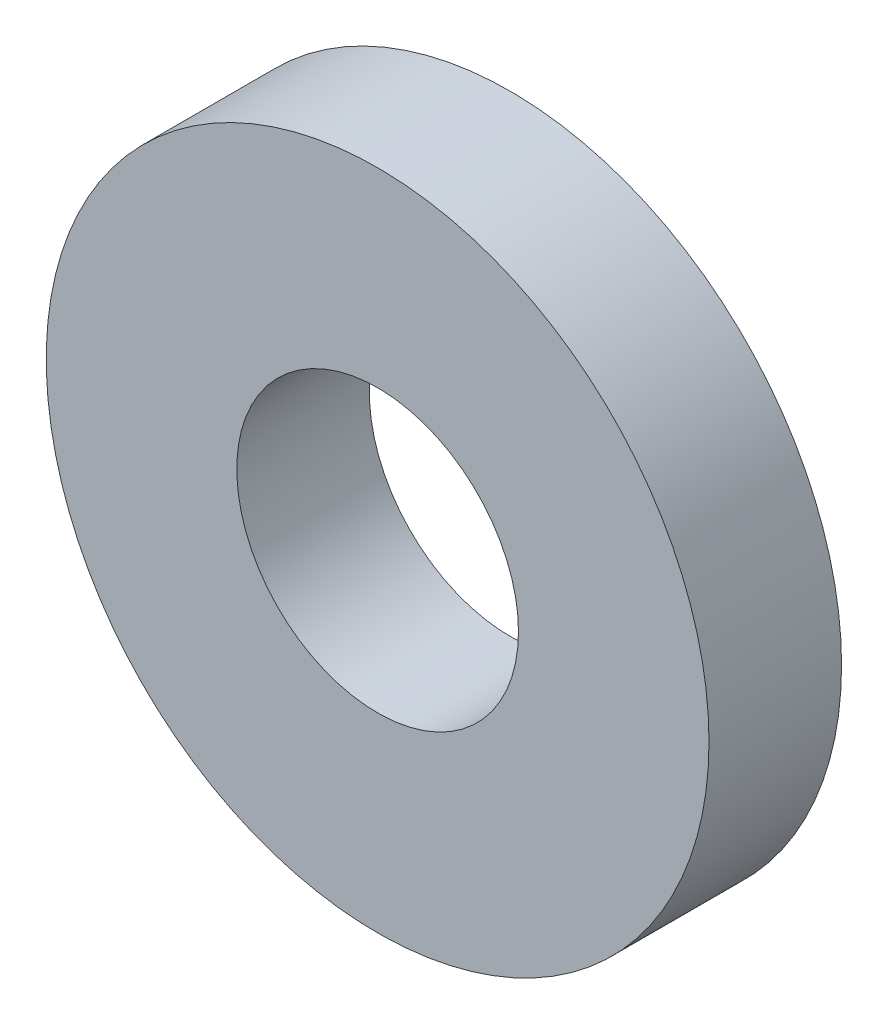
ISO-10303-21;
HEADER;
FILE_DESCRIPTION(('STEP AP214'),'2;1');
FILE_NAME('part.step','',(''),(''),'','','');
FILE_SCHEMA(('AUTOMOTIVE_DESIGN { 1 0 10303 214 1 1 1 1 }'));
ENDSEC;
DATA;
#1=APPLICATION_CONTEXT('core data for automotive mechanical design processes');
#2=APPLICATION_PROTOCOL_DEFINITION('international standard','automotive_design',2000,#1);
#3=PRODUCT_CONTEXT('',#1,'mechanical');
#4=PRODUCT('Part','Part','',(#3));
#5=PRODUCT_RELATED_PRODUCT_CATEGORY('part','',(#4));
#6=PRODUCT_DEFINITION_FORMATION('','',#4);
#7=PRODUCT_DEFINITION_CONTEXT('part definition',#1,'design');
#8=PRODUCT_DEFINITION('design','',#6,#7);
#9=PRODUCT_DEFINITION_SHAPE('','',#8);
#10=(LENGTH_UNIT() NAMED_UNIT(*) SI_UNIT(.MILLI.,.METRE.));
#11=(NAMED_UNIT(*) PLANE_ANGLE_UNIT() SI_UNIT($,.RADIAN.));
#12=(NAMED_UNIT(*) SI_UNIT($,.STERADIAN.) SOLID_ANGLE_UNIT());
#13=UNCERTAINTY_MEASURE_WITH_UNIT(LENGTH_MEASURE(1.E-05),#10,'distance_accuracy_value','');
#14=(GEOMETRIC_REPRESENTATION_CONTEXT(3) GLOBAL_UNCERTAINTY_ASSIGNED_CONTEXT((#13)) GLOBAL_UNIT_ASSIGNED_CONTEXT((#10,
#11,#12)) REPRESENTATION_CONTEXT('',''));
#15=CARTESIAN_POINT('',(0.,0.,0.));
#16=DIRECTION('',(0.,0.,1.));
#17=DIRECTION('',(1.,0.,0.));
#18=AXIS2_PLACEMENT_3D('',#15,#16,#17);
#19=CARTESIAN_POINT('',(0.,0.,-4.));
#20=DIRECTION('',(0.,0.,1.));
#21=DIRECTION('',(1.,0.,0.));
#22=AXIS2_PLACEMENT_3D('',#19,#20,#21);
#23=CYLINDRICAL_SURFACE('',#22,10.);
#24=CARTESIAN_POINT('',(0.,0.,-4.));
#25=DIRECTION('',(0.,0.,1.));
#26=DIRECTION('',(1.,0.,0.));
#27=AXIS2_PLACEMENT_3D('',#24,#25,#26);
#28=CIRCLE('',#27,10.);
#29=CARTESIAN_POINT('',(10.,0.,-4.));
#30=VERTEX_POINT('',#29);
#31=EDGE_CURVE('E10',#30,#30,#28,.T.);
#32=ORIENTED_EDGE('',*,*,#31,.T.);
#33=EDGE_LOOP('',(#32));
#34=FACE_BOUND('',#33,.T.);
#35=CARTESIAN_POINT('',(0.,0.,0.));
#36=DIRECTION('',(0.,0.,1.));
#37=DIRECTION('',(1.,0.,0.));
#38=AXIS2_PLACEMENT_3D('',#35,#36,#37);
#39=CIRCLE('',#38,10.);
#40=CARTESIAN_POINT('',(10.,0.,0.));
#41=VERTEX_POINT('',#40);
#42=EDGE_CURVE('E40',#41,#41,#39,.T.);
#43=ORIENTED_EDGE('',*,*,#42,.F.);
#44=EDGE_LOOP('',(#43));
#45=FACE_BOUND('',#44,.T.);
#46=ADVANCED_FACE('F37',(#34,#45),#23,.T.);
#47=CARTESIAN_POINT('',(0.,0.,-4.));
#48=DIRECTION('',(0.,0.,1.));
#49=DIRECTION('',(1.,0.,0.));
#50=AXIS2_PLACEMENT_3D('',#47,#48,#49);
#51=PLANE('',#50);
#52=CARTESIAN_POINT('',(0.,0.,-4.));
#53=DIRECTION('',(0.,0.,1.));
#54=DIRECTION('',(1.,0.,0.));
#55=AXIS2_PLACEMENT_3D('',#52,#53,#54);
#56=CIRCLE('',#55,4.25);
#57=CARTESIAN_POINT('',(4.25,0.,-4.));
#58=VERTEX_POINT('',#57);
#59=EDGE_CURVE('E47',#58,#58,#56,.T.);
#60=ORIENTED_EDGE('',*,*,#59,.T.);
#61=EDGE_LOOP('',(#60));
#62=FACE_BOUND('',#61,.T.);
#63=ORIENTED_EDGE('',*,*,#31,.F.);
#64=EDGE_LOOP('',(#63));
#65=FACE_BOUND('',#64,.T.);
#66=ADVANCED_FACE('F55',(#62,#65),#51,.F.);
#67=CARTESIAN_POINT('',(0.,0.,0.));
#68=DIRECTION('',(0.,0.,1.));
#69=DIRECTION('',(1.,0.,0.));
#70=AXIS2_PLACEMENT_3D('',#67,#68,#69);
#71=PLANE('',#70);
#72=CARTESIAN_POINT('',(0.,0.,0.));
#73=DIRECTION('',(0.,0.,1.));
#74=DIRECTION('',(1.,0.,0.));
#75=AXIS2_PLACEMENT_3D('',#72,#73,#74);
#76=CIRCLE('',#75,4.25);
#77=CARTESIAN_POINT('',(4.25,0.,0.));
#78=VERTEX_POINT('',#77);
#79=EDGE_CURVE('E49',#78,#78,#76,.T.);
#80=ORIENTED_EDGE('',*,*,#79,.F.);
#81=EDGE_LOOP('',(#80));
#82=FACE_BOUND('',#81,.T.);
#83=ORIENTED_EDGE('',*,*,#42,.T.);
#84=EDGE_LOOP('',(#83));
#85=FACE_BOUND('',#84,.T.);
#86=ADVANCED_FACE('F61',(#82,#85),#71,.T.);
#87=CARTESIAN_POINT('',(0.,0.,-4.));
#88=DIRECTION('',(0.,0.,1.));
#89=DIRECTION('',(1.,0.,0.));
#90=AXIS2_PLACEMENT_3D('',#87,#88,#89);
#91=CYLINDRICAL_SURFACE('',#90,4.25);
#92=ORIENTED_EDGE('',*,*,#59,.F.);
#93=EDGE_LOOP('',(#92));
#94=FACE_BOUND('',#93,.T.);
#95=ORIENTED_EDGE('',*,*,#79,.T.);
#96=EDGE_LOOP('',(#95));
#97=FACE_BOUND('',#96,.T.);
#98=ADVANCED_FACE('F58',(#94,#97),#91,.F.);
#99=CLOSED_SHELL('',(#46,#66,#86,#98));
#100=MANIFOLD_SOLID_BREP('B2',#99);
#101=ADVANCED_BREP_SHAPE_REPRESENTATION('',(#18,#100),#14);
#102=SHAPE_DEFINITION_REPRESENTATION(#9,#101);
ENDSEC;
END-ISO-10303-21;
